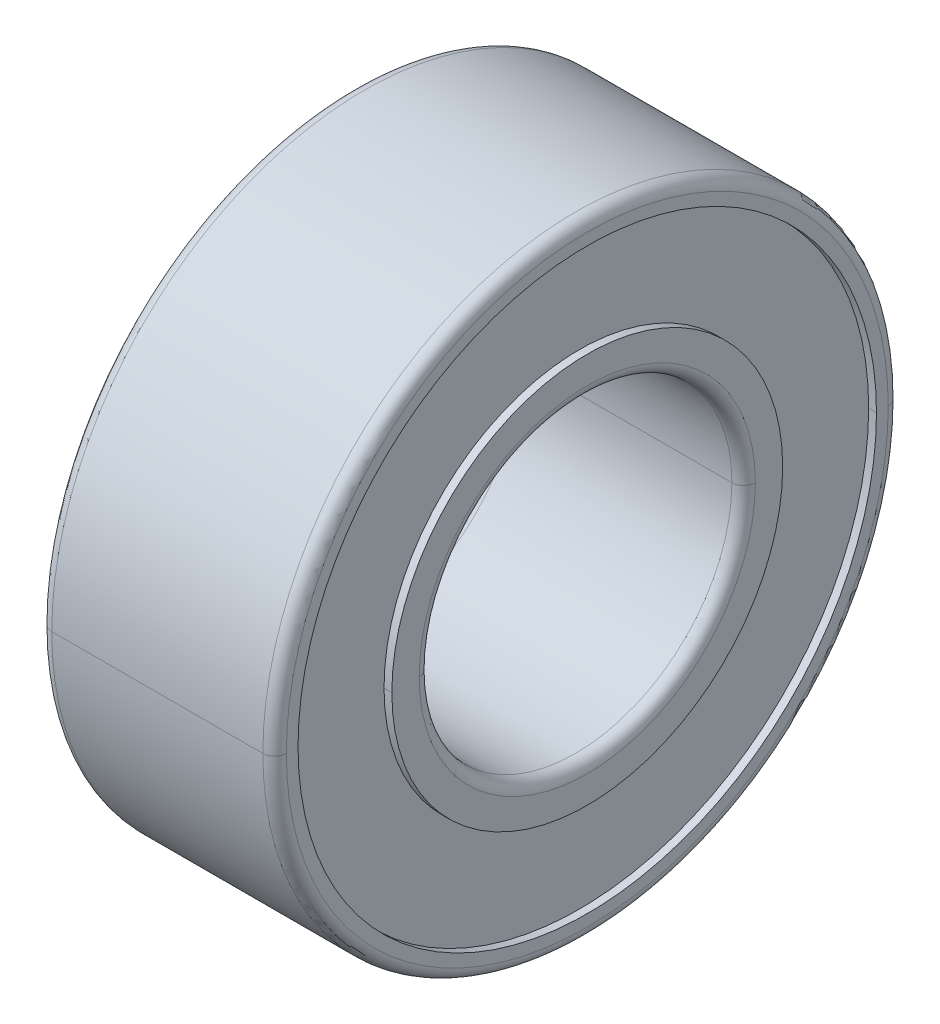
ISO-10303-21;
HEADER;
FILE_DESCRIPTION(('STEP AP214'),'2;1');
FILE_NAME('part.step','',(''),(''),'','','');
FILE_SCHEMA(('AUTOMOTIVE_DESIGN { 1 0 10303 214 1 1 1 1 }'));
ENDSEC;
DATA;
#1=APPLICATION_CONTEXT('core data for automotive mechanical design processes');
#2=APPLICATION_PROTOCOL_DEFINITION('international standard','automotive_design',2000,#1);
#3=PRODUCT_CONTEXT('',#1,'mechanical');
#4=PRODUCT('Part','Part','',(#3));
#5=PRODUCT_RELATED_PRODUCT_CATEGORY('part','',(#4));
#6=PRODUCT_DEFINITION_FORMATION('','',#4);
#7=PRODUCT_DEFINITION_CONTEXT('part definition',#1,'design');
#8=PRODUCT_DEFINITION('design','',#6,#7);
#9=PRODUCT_DEFINITION_SHAPE('','',#8);
#10=(LENGTH_UNIT() NAMED_UNIT(*) SI_UNIT(.MILLI.,.METRE.));
#11=(NAMED_UNIT(*) PLANE_ANGLE_UNIT() SI_UNIT($,.RADIAN.));
#12=(NAMED_UNIT(*) SI_UNIT($,.STERADIAN.) SOLID_ANGLE_UNIT());
#13=UNCERTAINTY_MEASURE_WITH_UNIT(LENGTH_MEASURE(1.E-05),#10,'distance_accuracy_value','');
#14=(GEOMETRIC_REPRESENTATION_CONTEXT(3) GLOBAL_UNCERTAINTY_ASSIGNED_CONTEXT((#13)) GLOBAL_UNIT_ASSIGNED_CONTEXT((#10,
#11,#12)) REPRESENTATION_CONTEXT('',''));
#15=CARTESIAN_POINT('',(0.,0.,0.));
#16=DIRECTION('',(0.,0.,1.));
#17=DIRECTION('',(1.,0.,0.));
#18=AXIS2_PLACEMENT_3D('',#15,#16,#17);
#19=CARTESIAN_POINT('',(0.75,0.,0.));
#20=DIRECTION('',(-1.,0.,0.));
#21=DIRECTION('',(0.,0.,1.));
#22=AXIS2_PLACEMENT_3D('',#19,#20,#21);
#23=CYLINDRICAL_SURFACE('',#22,2.);
#24=DIRECTION('',(-1.,0.,0.));
#25=VECTOR('',#24,1.);
#26=CARTESIAN_POINT('',(0.75,0.,-2.));
#27=LINE('',#26,#25);
#28=CARTESIAN_POINT('',(1.35,0.,-2.));
#29=VERTEX_POINT('',#28);
#30=CARTESIAN_POINT('',(-1.35,0.,-2.));
#31=VERTEX_POINT('',#30);
#32=EDGE_CURVE('E195',#29,#31,#27,.T.);
#33=ORIENTED_EDGE('',*,*,#32,.F.);
#34=CARTESIAN_POINT('',(1.35,0.,0.));
#35=DIRECTION('',(1.,0.,0.));
#36=DIRECTION('',(0.,0.,1.));
#37=AXIS2_PLACEMENT_3D('',#34,#35,#36);
#38=CIRCLE('',#37,2.);
#39=CARTESIAN_POINT('',(1.35,0.,2.));
#40=VERTEX_POINT('',#39);
#41=EDGE_CURVE('E256',#29,#40,#38,.T.);
#42=ORIENTED_EDGE('',*,*,#41,.T.);
#43=DIRECTION('',(-1.,0.,0.));
#44=VECTOR('',#43,1.);
#45=CARTESIAN_POINT('',(0.75,0.,2.));
#46=LINE('',#45,#44);
#47=CARTESIAN_POINT('',(-1.35,0.,2.));
#48=VERTEX_POINT('',#47);
#49=EDGE_CURVE('E198',#40,#48,#46,.T.);
#50=ORIENTED_EDGE('',*,*,#49,.T.);
#51=CARTESIAN_POINT('',(-1.35,0.,0.));
#52=DIRECTION('',(1.,0.,0.));
#53=DIRECTION('',(0.,0.,1.));
#54=AXIS2_PLACEMENT_3D('',#51,#52,#53);
#55=CIRCLE('',#54,2.);
#56=EDGE_CURVE('E192',#31,#48,#55,.T.);
#57=ORIENTED_EDGE('',*,*,#56,.F.);
#58=EDGE_LOOP('',(#33,#42,#50,#57));
#59=FACE_BOUND('',#58,.T.);
#60=ADVANCED_FACE('F17',(#59),#23,.F.);
#61=CARTESIAN_POINT('',(1.5,0.,2.25));
#62=DIRECTION('',(-1.,0.,0.));
#63=DIRECTION('',(0.,0.,1.));
#64=AXIS2_PLACEMENT_3D('',#61,#62,#63);
#65=PLANE('',#64);
#66=CARTESIAN_POINT('',(1.5,0.,0.));
#67=DIRECTION('',(-1.,0.,0.));
#68=DIRECTION('',(0.,0.,1.));
#69=AXIS2_PLACEMENT_3D('',#66,#67,#68);
#70=CIRCLE('',#69,2.15);
#71=CARTESIAN_POINT('',(1.5,0.,2.15));
#72=VERTEX_POINT('',#71);
#73=CARTESIAN_POINT('',(1.5,0.,-2.15));
#74=VERTEX_POINT('',#73);
#75=EDGE_CURVE('E255',#72,#74,#70,.T.);
#76=ORIENTED_EDGE('',*,*,#75,.T.);
#77=CARTESIAN_POINT('',(1.5,0.,0.));
#78=DIRECTION('',(-1.,0.,0.));
#79=DIRECTION('',(0.,0.,1.));
#80=AXIS2_PLACEMENT_3D('',#77,#78,#79);
#81=CIRCLE('',#80,2.15);
#82=EDGE_CURVE('E316',#74,#72,#81,.T.);
#83=ORIENTED_EDGE('',*,*,#82,.T.);
#84=EDGE_LOOP('',(#76,#83));
#85=FACE_BOUND('',#84,.T.);
#86=CARTESIAN_POINT('',(1.5,0.,0.));
#87=DIRECTION('',(-1.,0.,0.));
#88=DIRECTION('',(0.,0.,1.));
#89=AXIS2_PLACEMENT_3D('',#86,#87,#88);
#90=CIRCLE('',#89,2.5);
#91=CARTESIAN_POINT('',(1.5,0.,2.5));
#92=VERTEX_POINT('',#91);
#93=CARTESIAN_POINT('',(1.5,0.,-2.5));
#94=VERTEX_POINT('',#93);
#95=EDGE_CURVE('E293',#92,#94,#90,.T.);
#96=ORIENTED_EDGE('',*,*,#95,.F.);
#97=CARTESIAN_POINT('',(1.5,0.,0.));
#98=DIRECTION('',(-1.,0.,0.));
#99=DIRECTION('',(0.,0.,1.));
#100=AXIS2_PLACEMENT_3D('',#97,#98,#99);
#101=CIRCLE('',#100,2.5);
#102=EDGE_CURVE('E11',#94,#92,#101,.T.);
#103=ORIENTED_EDGE('',*,*,#102,.F.);
#104=EDGE_LOOP('',(#96,#103));
#105=FACE_BOUND('',#104,.T.);
#106=ADVANCED_FACE('F424',(#85,#105),#65,.F.);
#107=CARTESIAN_POINT('',(0.75,0.,0.));
#108=DIRECTION('',(-1.,0.,0.));
#109=DIRECTION('',(0.,0.,1.));
#110=AXIS2_PLACEMENT_3D('',#107,#108,#109);
#111=CYLINDRICAL_SURFACE('',#110,2.5);
#112=DIRECTION('',(-1.,0.,0.));
#113=VECTOR('',#112,1.);
#114=CARTESIAN_POINT('',(0.75,0.,-2.5));
#115=LINE('',#114,#113);
#116=CARTESIAN_POINT('',(1.4,0.,-2.5));
#117=VERTEX_POINT('',#116);
#118=EDGE_CURVE('E289',#94,#117,#115,.T.);
#119=ORIENTED_EDGE('',*,*,#118,.F.);
#120=ORIENTED_EDGE('',*,*,#102,.T.);
#121=DIRECTION('',(-1.,0.,0.));
#122=VECTOR('',#121,1.);
#123=CARTESIAN_POINT('',(0.75,0.,2.5));
#124=LINE('',#123,#122);
#125=CARTESIAN_POINT('',(1.4,0.,2.5));
#126=VERTEX_POINT('',#125);
#127=EDGE_CURVE('E233',#92,#126,#124,.T.);
#128=ORIENTED_EDGE('',*,*,#127,.T.);
#129=CARTESIAN_POINT('',(1.4,0.,0.));
#130=DIRECTION('',(-1.,0.,0.));
#131=DIRECTION('',(0.,0.,1.));
#132=AXIS2_PLACEMENT_3D('',#129,#130,#131);
#133=CIRCLE('',#132,2.5);
#134=EDGE_CURVE('E27',#117,#126,#133,.T.);
#135=ORIENTED_EDGE('',*,*,#134,.F.);
#136=EDGE_LOOP('',(#119,#120,#128,#135));
#137=FACE_BOUND('',#136,.T.);
#138=ADVANCED_FACE('F429',(#137),#111,.T.);
#139=CARTESIAN_POINT('',(1.4,0.,3.1));
#140=DIRECTION('',(-1.,0.,0.));
#141=DIRECTION('',(0.,0.,1.));
#142=AXIS2_PLACEMENT_3D('',#139,#140,#141);
#143=PLANE('',#142);
#144=CARTESIAN_POINT('',(1.4,0.,0.));
#145=DIRECTION('',(-1.,0.,0.));
#146=DIRECTION('',(0.,0.,1.));
#147=AXIS2_PLACEMENT_3D('',#144,#145,#146);
#148=CIRCLE('',#147,2.5);
#149=EDGE_CURVE('E237',#126,#117,#148,.T.);
#150=ORIENTED_EDGE('',*,*,#149,.T.);
#151=ORIENTED_EDGE('',*,*,#134,.T.);
#152=EDGE_LOOP('',(#150,#151));
#153=FACE_BOUND('',#152,.T.);
#154=CARTESIAN_POINT('',(1.4,0.,0.));
#155=DIRECTION('',(-1.,0.,0.));
#156=DIRECTION('',(0.,0.,1.));
#157=AXIS2_PLACEMENT_3D('',#154,#155,#156);
#158=CIRCLE('',#157,3.7);
#159=CARTESIAN_POINT('',(1.4,0.,3.7));
#160=VERTEX_POINT('',#159);
#161=CARTESIAN_POINT('',(1.4,0.,-3.7));
#162=VERTEX_POINT('',#161);
#163=EDGE_CURVE('E134',#160,#162,#158,.T.);
#164=ORIENTED_EDGE('',*,*,#163,.F.);
#165=CARTESIAN_POINT('',(1.4,0.,0.));
#166=DIRECTION('',(-1.,0.,0.));
#167=DIRECTION('',(0.,0.,1.));
#168=AXIS2_PLACEMENT_3D('',#165,#166,#167);
#169=CIRCLE('',#168,3.7);
#170=EDGE_CURVE('E21',#162,#160,#169,.T.);
#171=ORIENTED_EDGE('',*,*,#170,.F.);
#172=EDGE_LOOP('',(#164,#171));
#173=FACE_BOUND('',#172,.T.);
#174=ADVANCED_FACE('F420',(#153,#173),#143,.F.);
#175=CARTESIAN_POINT('',(0.75,0.,0.));
#176=DIRECTION('',(-1.,0.,0.));
#177=DIRECTION('',(0.,0.,1.));
#178=AXIS2_PLACEMENT_3D('',#175,#176,#177);
#179=CYLINDRICAL_SURFACE('',#178,3.7);
#180=DIRECTION('',(-1.,0.,0.));
#181=VECTOR('',#180,1.);
#182=CARTESIAN_POINT('',(0.75,0.,-3.7));
#183=LINE('',#182,#181);
#184=CARTESIAN_POINT('',(1.5,0.,-3.7));
#185=VERTEX_POINT('',#184);
#186=EDGE_CURVE('E241',#185,#162,#183,.T.);
#187=ORIENTED_EDGE('',*,*,#186,.F.);
#188=CARTESIAN_POINT('',(1.5,0.,0.));
#189=DIRECTION('',(-1.,0.,0.));
#190=DIRECTION('',(0.,0.,1.));
#191=AXIS2_PLACEMENT_3D('',#188,#189,#190);
#192=CIRCLE('',#191,3.7);
#193=CARTESIAN_POINT('',(1.5,0.,3.7));
#194=VERTEX_POINT('',#193);
#195=EDGE_CURVE('E265',#194,#185,#192,.T.);
#196=ORIENTED_EDGE('',*,*,#195,.F.);
#197=DIRECTION('',(-1.,0.,0.));
#198=VECTOR('',#197,1.);
#199=CARTESIAN_POINT('',(0.75,0.,3.7));
#200=LINE('',#199,#198);
#201=EDGE_CURVE('E269',#194,#160,#200,.T.);
#202=ORIENTED_EDGE('',*,*,#201,.T.);
#203=ORIENTED_EDGE('',*,*,#163,.T.);
#204=EDGE_LOOP('',(#187,#196,#202,#203));
#205=FACE_BOUND('',#204,.T.);
#206=ADVANCED_FACE('F411',(#205),#179,.F.);
#207=CARTESIAN_POINT('',(1.5,0.,3.85));
#208=DIRECTION('',(-1.,0.,0.));
#209=DIRECTION('',(0.,0.,1.));
#210=AXIS2_PLACEMENT_3D('',#207,#208,#209);
#211=PLANE('',#210);
#212=ORIENTED_EDGE('',*,*,#195,.T.);
#213=CARTESIAN_POINT('',(1.5,0.,0.));
#214=DIRECTION('',(-1.,0.,0.));
#215=DIRECTION('',(0.,0.,1.));
#216=AXIS2_PLACEMENT_3D('',#213,#214,#215);
#217=CIRCLE('',#216,3.7);
#218=EDGE_CURVE('E236',#185,#194,#217,.T.);
#219=ORIENTED_EDGE('',*,*,#218,.T.);
#220=EDGE_LOOP('',(#212,#219));
#221=FACE_BOUND('',#220,.T.);
#222=CARTESIAN_POINT('',(1.5,0.,0.));
#223=DIRECTION('',(1.,0.,0.));
#224=DIRECTION('',(0.,0.,1.));
#225=AXIS2_PLACEMENT_3D('',#222,#223,#224);
#226=CIRCLE('',#225,3.85);
#227=CARTESIAN_POINT('',(1.5,0.,3.85));
#228=VERTEX_POINT('',#227);
#229=CARTESIAN_POINT('',(1.5,0.,-3.85));
#230=VERTEX_POINT('',#229);
#231=EDGE_CURVE('E327',#228,#230,#226,.T.);
#232=ORIENTED_EDGE('',*,*,#231,.T.);
#233=CARTESIAN_POINT('',(1.5,0.,0.));
#234=DIRECTION('',(1.,0.,0.));
#235=DIRECTION('',(0.,0.,1.));
#236=AXIS2_PLACEMENT_3D('',#233,#234,#235);
#237=CIRCLE('',#236,3.85);
#238=EDGE_CURVE('E250',#230,#228,#237,.T.);
#239=ORIENTED_EDGE('',*,*,#238,.T.);
#240=EDGE_LOOP('',(#232,#239));
#241=FACE_BOUND('',#240,.T.);
#242=ADVANCED_FACE('F409',(#221,#241),#211,.F.);
#243=CARTESIAN_POINT('',(0.75,0.,0.));
#244=DIRECTION('',(-1.,0.,0.));
#245=DIRECTION('',(0.,0.,1.));
#246=AXIS2_PLACEMENT_3D('',#243,#244,#245);
#247=CYLINDRICAL_SURFACE('',#246,4.);
#248=DIRECTION('',(-1.,0.,0.));
#249=VECTOR('',#248,1.);
#250=CARTESIAN_POINT('',(0.75,0.,-4.));
#251=LINE('',#250,#249);
#252=CARTESIAN_POINT('',(1.35,0.,-4.));
#253=VERTEX_POINT('',#252);
#254=CARTESIAN_POINT('',(-1.35,0.,-4.));
#255=VERTEX_POINT('',#254);
#256=EDGE_CURVE('E246',#253,#255,#251,.T.);
#257=ORIENTED_EDGE('',*,*,#256,.F.);
#258=CARTESIAN_POINT('',(1.35,0.,0.));
#259=DIRECTION('',(-1.,0.,0.));
#260=DIRECTION('',(0.,0.,1.));
#261=AXIS2_PLACEMENT_3D('',#258,#259,#260);
#262=CIRCLE('',#261,4.);
#263=CARTESIAN_POINT('',(1.35,0.,4.));
#264=VERTEX_POINT('',#263);
#265=EDGE_CURVE('E123',#253,#264,#262,.T.);
#266=ORIENTED_EDGE('',*,*,#265,.T.);
#267=DIRECTION('',(-1.,0.,0.));
#268=VECTOR('',#267,1.);
#269=CARTESIAN_POINT('',(0.75,0.,4.));
#270=LINE('',#269,#268);
#271=CARTESIAN_POINT('',(-1.35,0.,4.));
#272=VERTEX_POINT('',#271);
#273=EDGE_CURVE('E245',#264,#272,#270,.T.);
#274=ORIENTED_EDGE('',*,*,#273,.T.);
#275=CARTESIAN_POINT('',(-1.35,0.,0.));
#276=DIRECTION('',(-1.,0.,0.));
#277=DIRECTION('',(0.,0.,1.));
#278=AXIS2_PLACEMENT_3D('',#275,#276,#277);
#279=CIRCLE('',#278,4.);
#280=EDGE_CURVE('E107',#255,#272,#279,.T.);
#281=ORIENTED_EDGE('',*,*,#280,.F.);
#282=EDGE_LOOP('',(#257,#266,#274,#281));
#283=FACE_BOUND('',#282,.T.);
#284=ADVANCED_FACE('F402',(#283),#247,.T.);
#285=CARTESIAN_POINT('',(1.35,0.,0.));
#286=DIRECTION('',(-1.,0.,0.));
#287=DIRECTION('',(0.,0.,1.));
#288=AXIS2_PLACEMENT_3D('',#285,#286,#287);
#289=TOROIDAL_SURFACE('',#288,3.85,0.15);
#290=CARTESIAN_POINT('',(1.35,0.,-3.85));
#291=DIRECTION('',(0.,1.,0.));
#292=DIRECTION('',(0.,0.,1.));
#293=AXIS2_PLACEMENT_3D('',#290,#291,#292);
#294=CIRCLE('',#293,0.15);
#295=EDGE_CURVE('E276',#230,#253,#294,.T.);
#296=ORIENTED_EDGE('',*,*,#295,.F.);
#297=ORIENTED_EDGE('',*,*,#231,.F.);
#298=CARTESIAN_POINT('',(1.35,0.,3.85));
#299=DIRECTION('',(0.,-1.,0.));
#300=DIRECTION('',(0.,0.,-1.));
#301=AXIS2_PLACEMENT_3D('',#298,#299,#300);
#302=CIRCLE('',#301,0.15);
#303=EDGE_CURVE('E286',#228,#264,#302,.T.);
#304=ORIENTED_EDGE('',*,*,#303,.T.);
#305=ORIENTED_EDGE('',*,*,#265,.F.);
#306=EDGE_LOOP('',(#296,#297,#304,#305));
#307=FACE_BOUND('',#306,.T.);
#308=ADVANCED_FACE('F404',(#307),#289,.T.);
#309=CARTESIAN_POINT('',(1.35,0.,0.));
#310=DIRECTION('',(-1.,0.,0.));
#311=DIRECTION('',(0.,0.,1.));
#312=AXIS2_PLACEMENT_3D('',#309,#310,#311);
#313=TOROIDAL_SURFACE('',#312,2.15,0.15);
#314=CARTESIAN_POINT('',(1.35,0.,-2.15));
#315=DIRECTION('',(0.,1.,0.));
#316=DIRECTION('',(0.,0.,1.));
#317=AXIS2_PLACEMENT_3D('',#314,#315,#316);
#318=CIRCLE('',#317,0.15);
#319=EDGE_CURVE('E251',#29,#74,#318,.T.);
#320=ORIENTED_EDGE('',*,*,#319,.F.);
#321=CARTESIAN_POINT('',(1.35,0.,0.));
#322=DIRECTION('',(1.,0.,0.));
#323=DIRECTION('',(0.,0.,1.));
#324=AXIS2_PLACEMENT_3D('',#321,#322,#323);
#325=CIRCLE('',#324,2.);
#326=EDGE_CURVE('E221',#40,#29,#325,.T.);
#327=ORIENTED_EDGE('',*,*,#326,.F.);
#328=CARTESIAN_POINT('',(1.35,0.,2.15));
#329=DIRECTION('',(0.,-1.,0.));
#330=DIRECTION('',(0.,0.,-1.));
#331=AXIS2_PLACEMENT_3D('',#328,#329,#330);
#332=CIRCLE('',#331,0.15);
#333=EDGE_CURVE('E277',#40,#72,#332,.T.);
#334=ORIENTED_EDGE('',*,*,#333,.T.);
#335=ORIENTED_EDGE('',*,*,#82,.F.);
#336=EDGE_LOOP('',(#320,#327,#334,#335));
#337=FACE_BOUND('',#336,.T.);
#338=ADVANCED_FACE('F451',(#337),#313,.T.);
#339=CARTESIAN_POINT('',(-1.5,0.,2.25));
#340=DIRECTION('',(1.,0.,0.));
#341=DIRECTION('',(0.,1.,0.));
#342=AXIS2_PLACEMENT_3D('',#339,#340,#341);
#343=PLANE('',#342);
#344=CARTESIAN_POINT('',(-1.5,0.,0.));
#345=DIRECTION('',(-1.,0.,0.));
#346=DIRECTION('',(0.,0.,1.));
#347=AXIS2_PLACEMENT_3D('',#344,#345,#346);
#348=CIRCLE('',#347,2.15);
#349=CARTESIAN_POINT('',(-1.5,0.,2.15));
#350=VERTEX_POINT('',#349);
#351=CARTESIAN_POINT('',(-1.5,0.,-2.15));
#352=VERTEX_POINT('',#351);
#353=EDGE_CURVE('E40',#350,#352,#348,.T.);
#354=ORIENTED_EDGE('',*,*,#353,.F.);
#355=CARTESIAN_POINT('',(-1.5,0.,0.));
#356=DIRECTION('',(-1.,0.,0.));
#357=DIRECTION('',(0.,0.,1.));
#358=AXIS2_PLACEMENT_3D('',#355,#356,#357);
#359=CIRCLE('',#358,2.15);
#360=EDGE_CURVE('E211',#352,#350,#359,.T.);
#361=ORIENTED_EDGE('',*,*,#360,.F.);
#362=EDGE_LOOP('',(#354,#361));
#363=FACE_BOUND('',#362,.T.);
#364=CARTESIAN_POINT('',(-1.5,0.,0.));
#365=DIRECTION('',(-1.,0.,0.));
#366=DIRECTION('',(0.,0.,1.));
#367=AXIS2_PLACEMENT_3D('',#364,#365,#366);
#368=CIRCLE('',#367,2.5);
#369=CARTESIAN_POINT('',(-1.5,0.,2.5));
#370=VERTEX_POINT('',#369);
#371=CARTESIAN_POINT('',(-1.5,0.,-2.5));
#372=VERTEX_POINT('',#371);
#373=EDGE_CURVE('E313',#370,#372,#368,.T.);
#374=ORIENTED_EDGE('',*,*,#373,.T.);
#375=CARTESIAN_POINT('',(-1.5,0.,0.));
#376=DIRECTION('',(-1.,0.,0.));
#377=DIRECTION('',(0.,0.,1.));
#378=AXIS2_PLACEMENT_3D('',#375,#376,#377);
#379=CIRCLE('',#378,2.5);
#380=EDGE_CURVE('E281',#372,#370,#379,.T.);
#381=ORIENTED_EDGE('',*,*,#380,.T.);
#382=EDGE_LOOP('',(#374,#381));
#383=FACE_BOUND('',#382,.T.);
#384=ADVANCED_FACE('F566',(#363,#383),#343,.F.);
#385=CARTESIAN_POINT('',(-0.75,0.,0.));
#386=DIRECTION('',(1.,0.,0.));
#387=DIRECTION('',(0.,0.,1.));
#388=AXIS2_PLACEMENT_3D('',#385,#386,#387);
#389=CYLINDRICAL_SURFACE('',#388,2.5);
#390=DIRECTION('',(1.,0.,0.));
#391=VECTOR('',#390,1.);
#392=CARTESIAN_POINT('',(-0.75,0.,-2.5));
#393=LINE('',#392,#391);
#394=CARTESIAN_POINT('',(-1.4,0.,-2.5));
#395=VERTEX_POINT('',#394);
#396=EDGE_CURVE('E262',#372,#395,#393,.T.);
#397=ORIENTED_EDGE('',*,*,#396,.F.);
#398=ORIENTED_EDGE('',*,*,#373,.F.);
#399=DIRECTION('',(1.,0.,0.));
#400=VECTOR('',#399,1.);
#401=CARTESIAN_POINT('',(-0.75,0.,2.5));
#402=LINE('',#401,#400);
#403=CARTESIAN_POINT('',(-1.4,0.,2.5));
#404=VERTEX_POINT('',#403);
#405=EDGE_CURVE('E261',#370,#404,#402,.T.);
#406=ORIENTED_EDGE('',*,*,#405,.T.);
#407=CARTESIAN_POINT('',(-1.4,0.,0.));
#408=DIRECTION('',(-1.,0.,0.));
#409=DIRECTION('',(0.,0.,1.));
#410=AXIS2_PLACEMENT_3D('',#407,#408,#409);
#411=CIRCLE('',#410,2.5);
#412=EDGE_CURVE('E317',#404,#395,#411,.T.);
#413=ORIENTED_EDGE('',*,*,#412,.T.);
#414=EDGE_LOOP('',(#397,#398,#406,#413));
#415=FACE_BOUND('',#414,.T.);
#416=ADVANCED_FACE('F552',(#415),#389,.T.);
#417=CARTESIAN_POINT('',(-1.4,0.,3.1));
#418=DIRECTION('',(1.,0.,0.));
#419=DIRECTION('',(0.,1.,0.));
#420=AXIS2_PLACEMENT_3D('',#417,#418,#419);
#421=PLANE('',#420);
#422=ORIENTED_EDGE('',*,*,#412,.F.);
#423=CARTESIAN_POINT('',(-1.4,0.,0.));
#424=DIRECTION('',(-1.,0.,0.));
#425=DIRECTION('',(0.,0.,1.));
#426=AXIS2_PLACEMENT_3D('',#423,#424,#425);
#427=CIRCLE('',#426,2.5);
#428=EDGE_CURVE('E257',#395,#404,#427,.T.);
#429=ORIENTED_EDGE('',*,*,#428,.F.);
#430=EDGE_LOOP('',(#422,#429));
#431=FACE_BOUND('',#430,.T.);
#432=CARTESIAN_POINT('',(-1.4,0.,0.));
#433=DIRECTION('',(-1.,0.,0.));
#434=DIRECTION('',(0.,0.,1.));
#435=AXIS2_PLACEMENT_3D('',#432,#433,#434);
#436=CIRCLE('',#435,3.7);
#437=CARTESIAN_POINT('',(-1.4,0.,3.7));
#438=VERTEX_POINT('',#437);
#439=CARTESIAN_POINT('',(-1.4,0.,-3.7));
#440=VERTEX_POINT('',#439);
#441=EDGE_CURVE('E304',#438,#440,#436,.T.);
#442=ORIENTED_EDGE('',*,*,#441,.T.);
#443=CARTESIAN_POINT('',(-1.4,0.,0.));
#444=DIRECTION('',(-1.,0.,0.));
#445=DIRECTION('',(0.,0.,1.));
#446=AXIS2_PLACEMENT_3D('',#443,#444,#445);
#447=CIRCLE('',#446,3.7);
#448=EDGE_CURVE('E332',#440,#438,#447,.T.);
#449=ORIENTED_EDGE('',*,*,#448,.T.);
#450=EDGE_LOOP('',(#442,#449));
#451=FACE_BOUND('',#450,.T.);
#452=ADVANCED_FACE('F437',(#431,#451),#421,.F.);
#453=CARTESIAN_POINT('',(-0.75,0.,0.));
#454=DIRECTION('',(1.,0.,0.));
#455=DIRECTION('',(0.,0.,1.));
#456=AXIS2_PLACEMENT_3D('',#453,#454,#455);
#457=CYLINDRICAL_SURFACE('',#456,3.7);
#458=DIRECTION('',(1.,0.,0.));
#459=VECTOR('',#458,1.);
#460=CARTESIAN_POINT('',(-0.75,0.,-3.7));
#461=LINE('',#460,#459);
#462=CARTESIAN_POINT('',(-1.5,0.,-3.7));
#463=VERTEX_POINT('',#462);
#464=EDGE_CURVE('E298',#463,#440,#461,.T.);
#465=ORIENTED_EDGE('',*,*,#464,.F.);
#466=CARTESIAN_POINT('',(-1.5,0.,0.));
#467=DIRECTION('',(-1.,0.,0.));
#468=DIRECTION('',(0.,0.,1.));
#469=AXIS2_PLACEMENT_3D('',#466,#467,#468);
#470=CIRCLE('',#469,3.7);
#471=CARTESIAN_POINT('',(-1.5,0.,3.7));
#472=VERTEX_POINT('',#471);
#473=EDGE_CURVE('E323',#463,#472,#470,.T.);
#474=ORIENTED_EDGE('',*,*,#473,.T.);
#475=DIRECTION('',(1.,0.,0.));
#476=VECTOR('',#475,1.);
#477=CARTESIAN_POINT('',(-0.75,0.,3.7));
#478=LINE('',#477,#476);
#479=EDGE_CURVE('E299',#472,#438,#478,.T.);
#480=ORIENTED_EDGE('',*,*,#479,.T.);
#481=ORIENTED_EDGE('',*,*,#448,.F.);
#482=EDGE_LOOP('',(#465,#474,#480,#481));
#483=FACE_BOUND('',#482,.T.);
#484=ADVANCED_FACE('F380',(#483),#457,.F.);
#485=CARTESIAN_POINT('',(-1.5,0.,3.85));
#486=DIRECTION('',(1.,0.,0.));
#487=DIRECTION('',(0.,1.,0.));
#488=AXIS2_PLACEMENT_3D('',#485,#486,#487);
#489=PLANE('',#488);
#490=CARTESIAN_POINT('',(-1.5,0.,0.));
#491=DIRECTION('',(-1.,0.,0.));
#492=DIRECTION('',(0.,0.,1.));
#493=AXIS2_PLACEMENT_3D('',#490,#491,#492);
#494=CIRCLE('',#493,3.7);
#495=EDGE_CURVE('E294',#472,#463,#494,.T.);
#496=ORIENTED_EDGE('',*,*,#495,.F.);
#497=ORIENTED_EDGE('',*,*,#473,.F.);
#498=EDGE_LOOP('',(#496,#497));
#499=FACE_BOUND('',#498,.T.);
#500=CARTESIAN_POINT('',(-1.5,0.,0.));
#501=DIRECTION('',(1.,0.,0.));
#502=DIRECTION('',(0.,0.,1.));
#503=AXIS2_PLACEMENT_3D('',#500,#501,#502);
#504=CIRCLE('',#503,3.85);
#505=CARTESIAN_POINT('',(-1.5,0.,3.85));
#506=VERTEX_POINT('',#505);
#507=CARTESIAN_POINT('',(-1.5,0.,-3.85));
#508=VERTEX_POINT('',#507);
#509=EDGE_CURVE('E303',#506,#508,#504,.T.);
#510=ORIENTED_EDGE('',*,*,#509,.F.);
#511=CARTESIAN_POINT('',(-1.5,0.,0.));
#512=DIRECTION('',(1.,0.,0.));
#513=DIRECTION('',(0.,0.,1.));
#514=AXIS2_PLACEMENT_3D('',#511,#512,#513);
#515=CIRCLE('',#514,3.85);
#516=EDGE_CURVE('E321',#508,#506,#515,.T.);
#517=ORIENTED_EDGE('',*,*,#516,.F.);
#518=EDGE_LOOP('',(#510,#517));
#519=FACE_BOUND('',#518,.T.);
#520=ADVANCED_FACE('F386',(#499,#519),#489,.F.);
#521=CARTESIAN_POINT('',(-1.35,0.,0.));
#522=DIRECTION('',(1.,0.,0.));
#523=DIRECTION('',(0.,0.,1.));
#524=AXIS2_PLACEMENT_3D('',#521,#522,#523);
#525=TOROIDAL_SURFACE('',#524,3.85,0.15);
#526=CARTESIAN_POINT('',(-1.35,0.,-3.85));
#527=DIRECTION('',(0.,-1.,0.));
#528=DIRECTION('',(0.,0.,-1.));
#529=AXIS2_PLACEMENT_3D('',#526,#527,#528);
#530=CIRCLE('',#529,0.15);
#531=EDGE_CURVE('E267',#508,#255,#530,.T.);
#532=ORIENTED_EDGE('',*,*,#531,.F.);
#533=ORIENTED_EDGE('',*,*,#516,.T.);
#534=CARTESIAN_POINT('',(-1.35,0.,3.85));
#535=DIRECTION('',(0.,1.,0.));
#536=DIRECTION('',(0.,0.,1.));
#537=AXIS2_PLACEMENT_3D('',#534,#535,#536);
#538=CIRCLE('',#537,0.15);
#539=EDGE_CURVE('E212',#506,#272,#538,.T.);
#540=ORIENTED_EDGE('',*,*,#539,.T.);
#541=CARTESIAN_POINT('',(-1.35,0.,0.));
#542=DIRECTION('',(-1.,0.,0.));
#543=DIRECTION('',(0.,0.,1.));
#544=AXIS2_PLACEMENT_3D('',#541,#542,#543);
#545=CIRCLE('',#544,4.);
#546=EDGE_CURVE('E242',#272,#255,#545,.T.);
#547=ORIENTED_EDGE('',*,*,#546,.T.);
#548=EDGE_LOOP('',(#532,#533,#540,#547));
#549=FACE_BOUND('',#548,.T.);
#550=ADVANCED_FACE('F389',(#549),#525,.T.);
#551=CARTESIAN_POINT('',(-1.35,0.,0.));
#552=DIRECTION('',(1.,0.,0.));
#553=DIRECTION('',(0.,0.,1.));
#554=AXIS2_PLACEMENT_3D('',#551,#552,#553);
#555=TOROIDAL_SURFACE('',#554,2.15,0.15);
#556=CARTESIAN_POINT('',(-1.35,0.,-2.15));
#557=DIRECTION('',(0.,-1.,0.));
#558=DIRECTION('',(0.,0.,-1.));
#559=AXIS2_PLACEMENT_3D('',#556,#557,#558);
#560=CIRCLE('',#559,0.15);
#561=EDGE_CURVE('E205',#31,#352,#560,.T.);
#562=ORIENTED_EDGE('',*,*,#561,.F.);
#563=ORIENTED_EDGE('',*,*,#56,.T.);
#564=CARTESIAN_POINT('',(-1.35,0.,2.15));
#565=DIRECTION('',(0.,1.,0.));
#566=DIRECTION('',(0.,0.,1.));
#567=AXIS2_PLACEMENT_3D('',#564,#565,#566);
#568=CIRCLE('',#567,0.15);
#569=EDGE_CURVE('E202',#48,#350,#568,.T.);
#570=ORIENTED_EDGE('',*,*,#569,.T.);
#571=ORIENTED_EDGE('',*,*,#353,.T.);
#572=EDGE_LOOP('',(#562,#563,#570,#571));
#573=FACE_BOUND('',#572,.T.);
#574=ADVANCED_FACE('F207',(#573),#555,.T.);
#575=CARTESIAN_POINT('',(-1.35,0.,0.));
#576=DIRECTION('',(1.,0.,0.));
#577=DIRECTION('',(0.,0.,1.));
#578=AXIS2_PLACEMENT_3D('',#575,#576,#577);
#579=TOROIDAL_SURFACE('',#578,2.15,0.15);
#580=CARTESIAN_POINT('',(-1.35,0.,0.));
#581=DIRECTION('',(1.,0.,0.));
#582=DIRECTION('',(0.,0.,1.));
#583=AXIS2_PLACEMENT_3D('',#580,#581,#582);
#584=CIRCLE('',#583,2.);
#585=EDGE_CURVE('E214',#48,#31,#584,.T.);
#586=ORIENTED_EDGE('',*,*,#585,.T.);
#587=ORIENTED_EDGE('',*,*,#561,.T.);
#588=ORIENTED_EDGE('',*,*,#360,.T.);
#589=ORIENTED_EDGE('',*,*,#569,.F.);
#590=EDGE_LOOP('',(#586,#587,#588,#589));
#591=FACE_BOUND('',#590,.T.);
#592=ADVANCED_FACE('F215',(#591),#579,.T.);
#593=CARTESIAN_POINT('',(-1.35,0.,0.));
#594=DIRECTION('',(1.,0.,0.));
#595=DIRECTION('',(0.,0.,1.));
#596=AXIS2_PLACEMENT_3D('',#593,#594,#595);
#597=TOROIDAL_SURFACE('',#596,3.85,0.15);
#598=ORIENTED_EDGE('',*,*,#509,.T.);
#599=ORIENTED_EDGE('',*,*,#531,.T.);
#600=ORIENTED_EDGE('',*,*,#280,.T.);
#601=ORIENTED_EDGE('',*,*,#539,.F.);
#602=EDGE_LOOP('',(#598,#599,#600,#601));
#603=FACE_BOUND('',#602,.T.);
#604=ADVANCED_FACE('F395',(#603),#597,.T.);
#605=CARTESIAN_POINT('',(-0.75,0.,0.));
#606=DIRECTION('',(1.,0.,0.));
#607=DIRECTION('',(0.,0.,1.));
#608=AXIS2_PLACEMENT_3D('',#605,#606,#607);
#609=CYLINDRICAL_SURFACE('',#608,3.7);
#610=ORIENTED_EDGE('',*,*,#495,.T.);
#611=ORIENTED_EDGE('',*,*,#464,.T.);
#612=ORIENTED_EDGE('',*,*,#441,.F.);
#613=ORIENTED_EDGE('',*,*,#479,.F.);
#614=EDGE_LOOP('',(#610,#611,#612,#613));
#615=FACE_BOUND('',#614,.T.);
#616=ADVANCED_FACE('F385',(#615),#609,.F.);
#617=CARTESIAN_POINT('',(-0.75,0.,0.));
#618=DIRECTION('',(1.,0.,0.));
#619=DIRECTION('',(0.,0.,1.));
#620=AXIS2_PLACEMENT_3D('',#617,#618,#619);
#621=CYLINDRICAL_SURFACE('',#620,2.5);
#622=ORIENTED_EDGE('',*,*,#380,.F.);
#623=ORIENTED_EDGE('',*,*,#396,.T.);
#624=ORIENTED_EDGE('',*,*,#428,.T.);
#625=ORIENTED_EDGE('',*,*,#405,.F.);
#626=EDGE_LOOP('',(#622,#623,#624,#625));
#627=FACE_BOUND('',#626,.T.);
#628=ADVANCED_FACE('F443',(#627),#621,.T.);
#629=CARTESIAN_POINT('',(1.35,0.,0.));
#630=DIRECTION('',(-1.,0.,0.));
#631=DIRECTION('',(0.,0.,1.));
#632=AXIS2_PLACEMENT_3D('',#629,#630,#631);
#633=TOROIDAL_SURFACE('',#632,2.15,0.15);
#634=ORIENTED_EDGE('',*,*,#41,.F.);
#635=ORIENTED_EDGE('',*,*,#319,.T.);
#636=ORIENTED_EDGE('',*,*,#75,.F.);
#637=ORIENTED_EDGE('',*,*,#333,.F.);
#638=EDGE_LOOP('',(#634,#635,#636,#637));
#639=FACE_BOUND('',#638,.T.);
#640=ADVANCED_FACE('F452',(#639),#633,.T.);
#641=CARTESIAN_POINT('',(1.35,0.,0.));
#642=DIRECTION('',(-1.,0.,0.));
#643=DIRECTION('',(0.,0.,1.));
#644=AXIS2_PLACEMENT_3D('',#641,#642,#643);
#645=TOROIDAL_SURFACE('',#644,3.85,0.15);
#646=ORIENTED_EDGE('',*,*,#238,.F.);
#647=ORIENTED_EDGE('',*,*,#295,.T.);
#648=CARTESIAN_POINT('',(1.35,0.,0.));
#649=DIRECTION('',(-1.,0.,0.));
#650=DIRECTION('',(0.,0.,1.));
#651=AXIS2_PLACEMENT_3D('',#648,#649,#650);
#652=CIRCLE('',#651,4.);
#653=EDGE_CURVE('E272',#264,#253,#652,.T.);
#654=ORIENTED_EDGE('',*,*,#653,.F.);
#655=ORIENTED_EDGE('',*,*,#303,.F.);
#656=EDGE_LOOP('',(#646,#647,#654,#655));
#657=FACE_BOUND('',#656,.T.);
#658=ADVANCED_FACE('F407',(#657),#645,.T.);
#659=CARTESIAN_POINT('',(0.75,0.,0.));
#660=DIRECTION('',(-1.,0.,0.));
#661=DIRECTION('',(0.,0.,1.));
#662=AXIS2_PLACEMENT_3D('',#659,#660,#661);
#663=CYLINDRICAL_SURFACE('',#662,4.);
#664=ORIENTED_EDGE('',*,*,#653,.T.);
#665=ORIENTED_EDGE('',*,*,#256,.T.);
#666=ORIENTED_EDGE('',*,*,#546,.F.);
#667=ORIENTED_EDGE('',*,*,#273,.F.);
#668=EDGE_LOOP('',(#664,#665,#666,#667));
#669=FACE_BOUND('',#668,.T.);
#670=ADVANCED_FACE('F400',(#669),#663,.T.);
#671=CARTESIAN_POINT('',(0.75,0.,0.));
#672=DIRECTION('',(-1.,0.,0.));
#673=DIRECTION('',(0.,0.,1.));
#674=AXIS2_PLACEMENT_3D('',#671,#672,#673);
#675=CYLINDRICAL_SURFACE('',#674,3.7);
#676=ORIENTED_EDGE('',*,*,#218,.F.);
#677=ORIENTED_EDGE('',*,*,#186,.T.);
#678=ORIENTED_EDGE('',*,*,#170,.T.);
#679=ORIENTED_EDGE('',*,*,#201,.F.);
#680=EDGE_LOOP('',(#676,#677,#678,#679));
#681=FACE_BOUND('',#680,.T.);
#682=ADVANCED_FACE('F439',(#681),#675,.F.);
#683=CARTESIAN_POINT('',(0.75,0.,0.));
#684=DIRECTION('',(-1.,0.,0.));
#685=DIRECTION('',(0.,0.,1.));
#686=AXIS2_PLACEMENT_3D('',#683,#684,#685);
#687=CYLINDRICAL_SURFACE('',#686,2.5);
#688=ORIENTED_EDGE('',*,*,#95,.T.);
#689=ORIENTED_EDGE('',*,*,#118,.T.);
#690=ORIENTED_EDGE('',*,*,#149,.F.);
#691=ORIENTED_EDGE('',*,*,#127,.F.);
#692=EDGE_LOOP('',(#688,#689,#690,#691));
#693=FACE_BOUND('',#692,.T.);
#694=ADVANCED_FACE('F19',(#693),#687,.T.);
#695=CARTESIAN_POINT('',(0.75,0.,0.));
#696=DIRECTION('',(-1.,0.,0.));
#697=DIRECTION('',(0.,0.,1.));
#698=AXIS2_PLACEMENT_3D('',#695,#696,#697);
#699=CYLINDRICAL_SURFACE('',#698,2.);
#700=ORIENTED_EDGE('',*,*,#326,.T.);
#701=ORIENTED_EDGE('',*,*,#32,.T.);
#702=ORIENTED_EDGE('',*,*,#585,.F.);
#703=ORIENTED_EDGE('',*,*,#49,.F.);
#704=EDGE_LOOP('',(#700,#701,#702,#703));
#705=FACE_BOUND('',#704,.T.);
#706=ADVANCED_FACE('F219',(#705),#699,.F.);
#707=CLOSED_SHELL('',(#60,#106,#138,#174,#206,#242,#284,#308,#338,#384,#416,#452,#484,#520,#550,
#574,#592,#604,#616,#628,#640,#658,#670,#682,#694,#706));
#708=MANIFOLD_SOLID_BREP('B1',#707);
#709=ADVANCED_BREP_SHAPE_REPRESENTATION('',(#18,#708),#14);
#710=SHAPE_DEFINITION_REPRESENTATION(#9,#709);
ENDSEC;
END-ISO-10303-21;
